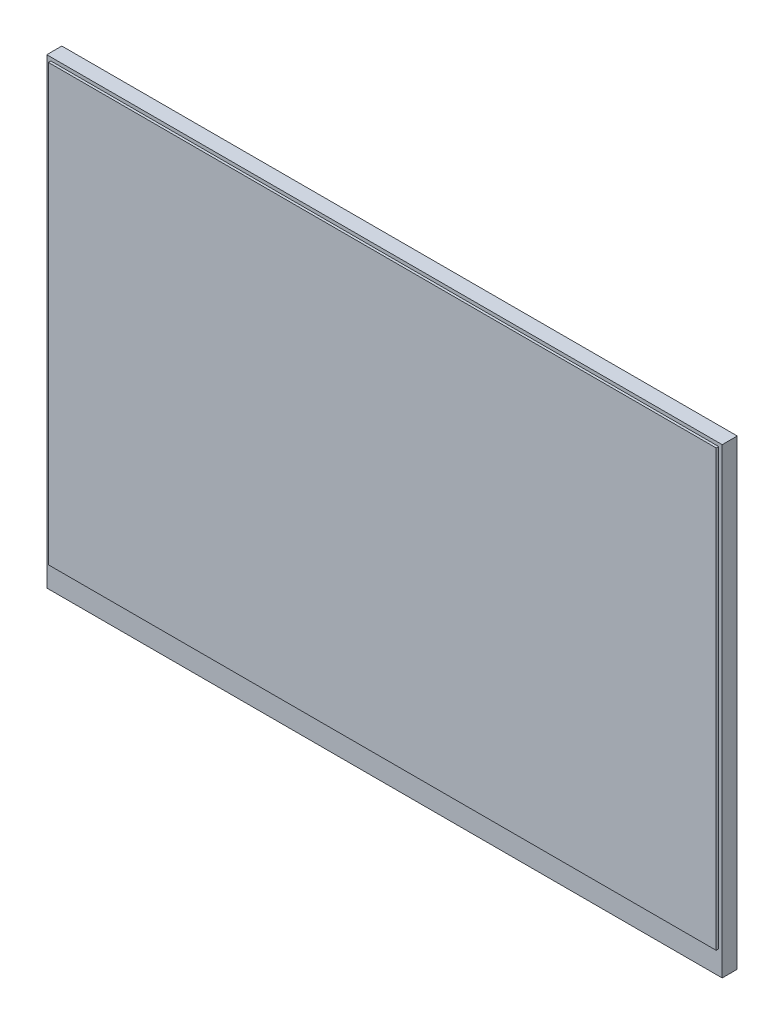
ISO-10303-21;
HEADER;
FILE_DESCRIPTION(('STEP AP214'),'2;1');
FILE_NAME('part.step','',(''),(''),'','','');
FILE_SCHEMA(('AUTOMOTIVE_DESIGN { 1 0 10303 214 1 1 1 1 }'));
ENDSEC;
DATA;
#1=APPLICATION_CONTEXT('core data for automotive mechanical design processes');
#2=APPLICATION_PROTOCOL_DEFINITION('international standard','automotive_design',2000,#1);
#3=PRODUCT_CONTEXT('',#1,'mechanical');
#4=PRODUCT('Part','Part','',(#3));
#5=PRODUCT_RELATED_PRODUCT_CATEGORY('part','',(#4));
#6=PRODUCT_DEFINITION_FORMATION('','',#4);
#7=PRODUCT_DEFINITION_CONTEXT('part definition',#1,'design');
#8=PRODUCT_DEFINITION('design','',#6,#7);
#9=PRODUCT_DEFINITION_SHAPE('','',#8);
#10=(LENGTH_UNIT() NAMED_UNIT(*) SI_UNIT(.MILLI.,.METRE.));
#11=(NAMED_UNIT(*) PLANE_ANGLE_UNIT() SI_UNIT($,.RADIAN.));
#12=(NAMED_UNIT(*) SI_UNIT($,.STERADIAN.) SOLID_ANGLE_UNIT());
#13=UNCERTAINTY_MEASURE_WITH_UNIT(LENGTH_MEASURE(1.E-05),#10,'distance_accuracy_value','');
#14=(GEOMETRIC_REPRESENTATION_CONTEXT(3) GLOBAL_UNCERTAINTY_ASSIGNED_CONTEXT((#13)) GLOBAL_UNIT_ASSIGNED_CONTEXT((#10,
#11,#12)) REPRESENTATION_CONTEXT('',''));
#15=CARTESIAN_POINT('',(0.,0.,0.));
#16=DIRECTION('',(0.,0.,1.));
#17=DIRECTION('',(1.,0.,0.));
#18=AXIS2_PLACEMENT_3D('',#15,#16,#17);
#19=CARTESIAN_POINT('',(352.834783771706,1145.33666707665,0.23));
#20=DIRECTION('',(1.,0.,0.));
#21=DIRECTION('',(0.,0.,-1.));
#22=AXIS2_PLACEMENT_3D('',#19,#20,#21);
#23=PLANE('',#22);
#24=DIRECTION('',(0.,-1.,0.));
#25=VECTOR('',#24,1.);
#26=CARTESIAN_POINT('',(352.834783771706,1145.33666707665,0.));
#27=LINE('',#26,#25);
#28=CARTESIAN_POINT('',(352.834783771706,1185.78501980202,0.));
#29=VERTEX_POINT('',#28);
#30=CARTESIAN_POINT('',(352.834783771706,1145.33666707665,0.));
#31=VERTEX_POINT('',#30);
#32=EDGE_CURVE('E135',#29,#31,#27,.T.);
#33=ORIENTED_EDGE('',*,*,#32,.T.);
#34=DIRECTION('',(0.,0.,-1.));
#35=VECTOR('',#34,1.);
#36=CARTESIAN_POINT('',(352.834783771706,1145.33666707665,0.23));
#37=LINE('',#36,#35);
#38=CARTESIAN_POINT('',(352.834783771706,1145.33666707665,0.23));
#39=VERTEX_POINT('',#38);
#40=EDGE_CURVE('E11',#39,#31,#37,.T.);
#41=ORIENTED_EDGE('',*,*,#40,.F.);
#42=DIRECTION('',(0.,-1.,0.));
#43=VECTOR('',#42,1.);
#44=CARTESIAN_POINT('',(352.834783771706,1145.33666707665,0.23));
#45=LINE('',#44,#43);
#46=CARTESIAN_POINT('',(352.834783771706,1185.78501980202,0.23));
#47=VERTEX_POINT('',#46);
#48=EDGE_CURVE('E137',#47,#39,#45,.T.);
#49=ORIENTED_EDGE('',*,*,#48,.F.);
#50=DIRECTION('',(0.,0.,-1.));
#51=VECTOR('',#50,1.);
#52=CARTESIAN_POINT('',(352.834783771706,1185.78501980202,0.23));
#53=LINE('',#52,#51);
#54=EDGE_CURVE('E145',#47,#29,#53,.T.);
#55=ORIENTED_EDGE('',*,*,#54,.T.);
#56=EDGE_LOOP('',(#33,#41,#49,#55));
#57=FACE_BOUND('',#56,.T.);
#58=ADVANCED_FACE('F33',(#57),#23,.F.);
#59=CARTESIAN_POINT('',(352.834783771706,1145.33666707665,0.23));
#60=DIRECTION('',(0.,1.,0.));
#61=DIRECTION('',(0.,0.,1.));
#62=AXIS2_PLACEMENT_3D('',#59,#60,#61);
#63=PLANE('',#62);
#64=DIRECTION('',(1.,0.,0.));
#65=VECTOR('',#64,1.);
#66=CARTESIAN_POINT('',(352.834783771706,1145.33666707665,0.));
#67=LINE('',#66,#65);
#68=CARTESIAN_POINT('',(414.908244408143,1145.33666707665,0.));
#69=VERTEX_POINT('',#68);
#70=EDGE_CURVE('E148',#31,#69,#67,.T.);
#71=ORIENTED_EDGE('',*,*,#70,.T.);
#72=DIRECTION('',(0.,0.,-1.));
#73=VECTOR('',#72,1.);
#74=CARTESIAN_POINT('',(414.908244408143,1145.33666707665,0.23));
#75=LINE('',#74,#73);
#76=CARTESIAN_POINT('',(414.908244408143,1145.33666707665,0.23));
#77=VERTEX_POINT('',#76);
#78=EDGE_CURVE('E41',#77,#69,#75,.T.);
#79=ORIENTED_EDGE('',*,*,#78,.F.);
#80=DIRECTION('',(1.,0.,0.));
#81=VECTOR('',#80,1.);
#82=CARTESIAN_POINT('',(352.834783771706,1145.33666707665,0.23));
#83=LINE('',#82,#81);
#84=EDGE_CURVE('E139',#39,#77,#83,.T.);
#85=ORIENTED_EDGE('',*,*,#84,.F.);
#86=ORIENTED_EDGE('',*,*,#40,.T.);
#87=EDGE_LOOP('',(#71,#79,#85,#86));
#88=FACE_BOUND('',#87,.T.);
#89=ADVANCED_FACE('F168',(#88),#63,.F.);
#90=CARTESIAN_POINT('',(414.908244408143,1145.33666707665,0.23));
#91=DIRECTION('',(-1.,0.,0.));
#92=DIRECTION('',(0.,0.,1.));
#93=AXIS2_PLACEMENT_3D('',#90,#91,#92);
#94=PLANE('',#93);
#95=DIRECTION('',(0.,1.,0.));
#96=VECTOR('',#95,1.);
#97=CARTESIAN_POINT('',(414.908244408143,1145.33666707665,0.));
#98=LINE('',#97,#96);
#99=CARTESIAN_POINT('',(414.908244408143,1185.78501980202,0.));
#100=VERTEX_POINT('',#99);
#101=EDGE_CURVE('E151',#69,#100,#98,.T.);
#102=ORIENTED_EDGE('',*,*,#101,.T.);
#103=DIRECTION('',(0.,0.,-1.));
#104=VECTOR('',#103,1.);
#105=CARTESIAN_POINT('',(414.908244408143,1185.78501980202,0.23));
#106=LINE('',#105,#104);
#107=CARTESIAN_POINT('',(414.908244408143,1185.78501980202,0.23));
#108=VERTEX_POINT('',#107);
#109=EDGE_CURVE('E158',#108,#100,#106,.T.);
#110=ORIENTED_EDGE('',*,*,#109,.F.);
#111=DIRECTION('',(0.,1.,0.));
#112=VECTOR('',#111,1.);
#113=CARTESIAN_POINT('',(414.908244408143,1145.33666707665,0.23));
#114=LINE('',#113,#112);
#115=EDGE_CURVE('E142',#77,#108,#114,.T.);
#116=ORIENTED_EDGE('',*,*,#115,.F.);
#117=ORIENTED_EDGE('',*,*,#78,.T.);
#118=EDGE_LOOP('',(#102,#110,#116,#117));
#119=FACE_BOUND('',#118,.T.);
#120=ADVANCED_FACE('F164',(#119),#94,.F.);
#121=CARTESIAN_POINT('',(352.834783771706,1185.78501980202,0.23));
#122=DIRECTION('',(0.,-1.,0.));
#123=DIRECTION('',(0.,0.,-1.));
#124=AXIS2_PLACEMENT_3D('',#121,#122,#123);
#125=PLANE('',#124);
#126=DIRECTION('',(-1.,0.,0.));
#127=VECTOR('',#126,1.);
#128=CARTESIAN_POINT('',(352.834783771706,1185.78501980202,0.));
#129=LINE('',#128,#127);
#130=EDGE_CURVE('E140',#100,#29,#129,.T.);
#131=ORIENTED_EDGE('',*,*,#130,.T.);
#132=ORIENTED_EDGE('',*,*,#54,.F.);
#133=DIRECTION('',(-1.,0.,0.));
#134=VECTOR('',#133,1.);
#135=CARTESIAN_POINT('',(352.834783771706,1185.78501980202,0.23));
#136=LINE('',#135,#134);
#137=EDGE_CURVE('E48',#108,#47,#136,.T.);
#138=ORIENTED_EDGE('',*,*,#137,.F.);
#139=ORIENTED_EDGE('',*,*,#109,.T.);
#140=EDGE_LOOP('',(#131,#132,#138,#139));
#141=FACE_BOUND('',#140,.T.);
#142=ADVANCED_FACE('F174',(#141),#125,.F.);
#143=CARTESIAN_POINT('',(0.,0.,0.23));
#144=DIRECTION('',(0.,0.,-1.));
#145=DIRECTION('',(-1.,0.,0.));
#146=AXIS2_PLACEMENT_3D('',#143,#144,#145);
#147=PLANE('',#146);
#148=ORIENTED_EDGE('',*,*,#48,.T.);
#149=ORIENTED_EDGE('',*,*,#84,.T.);
#150=ORIENTED_EDGE('',*,*,#115,.T.);
#151=ORIENTED_EDGE('',*,*,#137,.T.);
#152=EDGE_LOOP('',(#148,#149,#150,#151));
#153=FACE_BOUND('',#152,.T.);
#154=ADVANCED_FACE('F177',(#153),#147,.F.);
#155=CARTESIAN_POINT('',(352.448508255043,1144.8202111911,-0.6));
#156=DIRECTION('',(-1.,0.,0.));
#157=DIRECTION('',(0.,0.,1.));
#158=AXIS2_PLACEMENT_3D('',#155,#156,#157);
#159=PLANE('',#158);
#160=DIRECTION('',(0.,0.,1.));
#161=VECTOR('',#160,1.);
#162=CARTESIAN_POINT('',(352.448508255043,1143.15918423921,-1.4));
#163=LINE('',#162,#161);
#164=CARTESIAN_POINT('',(352.448508255043,1143.15918423921,-1.4));
#165=VERTEX_POINT('',#164);
#166=CARTESIAN_POINT('',(352.448508255043,1143.15918423921,0.));
#167=VERTEX_POINT('',#166);
#168=EDGE_CURVE('E94',#165,#167,#163,.T.);
#169=ORIENTED_EDGE('',*,*,#168,.T.);
#170=DIRECTION('',(0.,-1.,0.));
#171=VECTOR('',#170,1.);
#172=CARTESIAN_POINT('',(352.448508255043,1144.8202111911,0.));
#173=LINE('',#172,#171);
#174=CARTESIAN_POINT('',(352.448508255043,1186.09932135215,0.));
#175=VERTEX_POINT('',#174);
#176=EDGE_CURVE('E124',#175,#167,#173,.T.);
#177=ORIENTED_EDGE('',*,*,#176,.F.);
#178=DIRECTION('',(0.,0.,1.));
#179=VECTOR('',#178,1.);
#180=CARTESIAN_POINT('',(352.448508255043,1186.09932135215,-0.6));
#181=LINE('',#180,#179);
#182=CARTESIAN_POINT('',(352.448508255043,1186.09932135215,-1.4));
#183=VERTEX_POINT('',#182);
#184=EDGE_CURVE('E118',#183,#175,#181,.T.);
#185=ORIENTED_EDGE('',*,*,#184,.F.);
#186=DIRECTION('',(0.,-1.,0.));
#187=VECTOR('',#186,1.);
#188=CARTESIAN_POINT('',(352.448508255043,1143.15918423921,-1.4));
#189=LINE('',#188,#187);
#190=EDGE_CURVE('E112',#183,#165,#189,.T.);
#191=ORIENTED_EDGE('',*,*,#190,.T.);
#192=EDGE_LOOP('',(#169,#177,#185,#191));
#193=FACE_BOUND('',#192,.T.);
#194=ADVANCED_FACE('F117',(#193),#159,.T.);
#195=CARTESIAN_POINT('',(352.448508255043,1186.09932135215,-0.6));
#196=DIRECTION('',(0.,1.,0.));
#197=DIRECTION('',(0.,0.,1.));
#198=AXIS2_PLACEMENT_3D('',#195,#196,#197);
#199=PLANE('',#198);
#200=DIRECTION('',(-1.,0.,0.));
#201=VECTOR('',#200,1.);
#202=CARTESIAN_POINT('',(352.448508255043,1186.09932135215,0.));
#203=LINE('',#202,#201);
#204=CARTESIAN_POINT('',(415.240895221653,1186.09932135215,0.));
#205=VERTEX_POINT('',#204);
#206=EDGE_CURVE('E130',#205,#175,#203,.T.);
#207=ORIENTED_EDGE('',*,*,#206,.F.);
#208=DIRECTION('',(0.,0.,1.));
#209=VECTOR('',#208,1.);
#210=CARTESIAN_POINT('',(415.240895221653,1186.09932135215,-0.6));
#211=LINE('',#210,#209);
#212=CARTESIAN_POINT('',(415.240895221653,1186.09932135215,-1.4));
#213=VERTEX_POINT('',#212);
#214=EDGE_CURVE('E133',#213,#205,#211,.T.);
#215=ORIENTED_EDGE('',*,*,#214,.F.);
#216=DIRECTION('',(-1.,0.,0.));
#217=VECTOR('',#216,1.);
#218=CARTESIAN_POINT('',(352.448508255043,1186.09932135215,-1.4));
#219=LINE('',#218,#217);
#220=EDGE_CURVE('E105',#213,#183,#219,.T.);
#221=ORIENTED_EDGE('',*,*,#220,.T.);
#222=ORIENTED_EDGE('',*,*,#184,.T.);
#223=EDGE_LOOP('',(#207,#215,#221,#222));
#224=FACE_BOUND('',#223,.T.);
#225=ADVANCED_FACE('F184',(#224),#199,.T.);
#226=CARTESIAN_POINT('',(415.240895221653,1144.8202111911,-0.6));
#227=DIRECTION('',(1.,0.,0.));
#228=DIRECTION('',(0.,0.,-1.));
#229=AXIS2_PLACEMENT_3D('',#226,#227,#228);
#230=PLANE('',#229);
#231=DIRECTION('',(0.,1.,0.));
#232=VECTOR('',#231,1.);
#233=CARTESIAN_POINT('',(415.240895221653,1144.8202111911,0.));
#234=LINE('',#233,#232);
#235=CARTESIAN_POINT('',(415.240895221653,1143.15918423921,0.));
#236=VERTEX_POINT('',#235);
#237=EDGE_CURVE('E127',#236,#205,#234,.T.);
#238=ORIENTED_EDGE('',*,*,#237,.F.);
#239=DIRECTION('',(0.,0.,1.));
#240=VECTOR('',#239,1.);
#241=CARTESIAN_POINT('',(415.240895221653,1143.15918423921,-1.4));
#242=LINE('',#241,#240);
#243=CARTESIAN_POINT('',(415.240895221653,1143.15918423921,-1.4));
#244=VERTEX_POINT('',#243);
#245=EDGE_CURVE('E104',#244,#236,#242,.T.);
#246=ORIENTED_EDGE('',*,*,#245,.F.);
#247=DIRECTION('',(0.,1.,0.));
#248=VECTOR('',#247,1.);
#249=CARTESIAN_POINT('',(415.240895221653,1143.15918423921,-1.4));
#250=LINE('',#249,#248);
#251=EDGE_CURVE('E115',#244,#213,#250,.T.);
#252=ORIENTED_EDGE('',*,*,#251,.T.);
#253=ORIENTED_EDGE('',*,*,#214,.T.);
#254=EDGE_LOOP('',(#238,#246,#252,#253));
#255=FACE_BOUND('',#254,.T.);
#256=ADVANCED_FACE('F219',(#255),#230,.T.);
#257=CARTESIAN_POINT('',(0.,0.,0.));
#258=DIRECTION('',(0.,0.,-1.));
#259=DIRECTION('',(-1.,0.,0.));
#260=AXIS2_PLACEMENT_3D('',#257,#258,#259);
#261=PLANE('',#260);
#262=ORIENTED_EDGE('',*,*,#32,.F.);
#263=ORIENTED_EDGE('',*,*,#130,.F.);
#264=ORIENTED_EDGE('',*,*,#101,.F.);
#265=ORIENTED_EDGE('',*,*,#70,.F.);
#266=EDGE_LOOP('',(#262,#263,#264,#265));
#267=FACE_BOUND('',#266,.T.);
#268=ORIENTED_EDGE('',*,*,#176,.T.);
#269=DIRECTION('',(1.,0.,0.));
#270=VECTOR('',#269,1.);
#271=CARTESIAN_POINT('',(352.448508255043,1143.15918423921,0.));
#272=LINE('',#271,#270);
#273=EDGE_CURVE('E100',#167,#236,#272,.T.);
#274=ORIENTED_EDGE('',*,*,#273,.T.);
#275=ORIENTED_EDGE('',*,*,#237,.T.);
#276=ORIENTED_EDGE('',*,*,#206,.T.);
#277=EDGE_LOOP('',(#268,#274,#275,#276));
#278=FACE_BOUND('',#277,.T.);
#279=ADVANCED_FACE('F171',(#267,#278),#261,.F.);
#280=CARTESIAN_POINT('',(352.448508255043,1143.15918423921,-1.4));
#281=DIRECTION('',(0.,-1.,0.));
#282=DIRECTION('',(0.,0.,-1.));
#283=AXIS2_PLACEMENT_3D('',#280,#281,#282);
#284=PLANE('',#283);
#285=ORIENTED_EDGE('',*,*,#273,.F.);
#286=ORIENTED_EDGE('',*,*,#168,.F.);
#287=DIRECTION('',(1.,0.,0.));
#288=VECTOR('',#287,1.);
#289=CARTESIAN_POINT('',(352.448508255043,1143.15918423921,-1.4));
#290=LINE('',#289,#288);
#291=EDGE_CURVE('E98',#165,#244,#290,.T.);
#292=ORIENTED_EDGE('',*,*,#291,.T.);
#293=ORIENTED_EDGE('',*,*,#245,.T.);
#294=EDGE_LOOP('',(#285,#286,#292,#293));
#295=FACE_BOUND('',#294,.T.);
#296=ADVANCED_FACE('F96',(#295),#284,.T.);
#297=CARTESIAN_POINT('',(0.,0.,-1.4));
#298=DIRECTION('',(0.,0.,-1.));
#299=DIRECTION('',(-1.,0.,0.));
#300=AXIS2_PLACEMENT_3D('',#297,#298,#299);
#301=PLANE('',#300);
#302=ORIENTED_EDGE('',*,*,#190,.F.);
#303=ORIENTED_EDGE('',*,*,#220,.F.);
#304=ORIENTED_EDGE('',*,*,#251,.F.);
#305=ORIENTED_EDGE('',*,*,#291,.F.);
#306=EDGE_LOOP('',(#302,#303,#304,#305));
#307=FACE_BOUND('',#306,.T.);
#308=ADVANCED_FACE('F110',(#307),#301,.T.);
#309=CLOSED_SHELL('',(#58,#89,#120,#142,#154,#194,#225,#256,#279,#296,#308));
#310=MANIFOLD_SOLID_BREP('B2',#309);
#311=ADVANCED_BREP_SHAPE_REPRESENTATION('',(#18,#310),#14);
#312=SHAPE_DEFINITION_REPRESENTATION(#9,#311);
ENDSEC;
END-ISO-10303-21;
